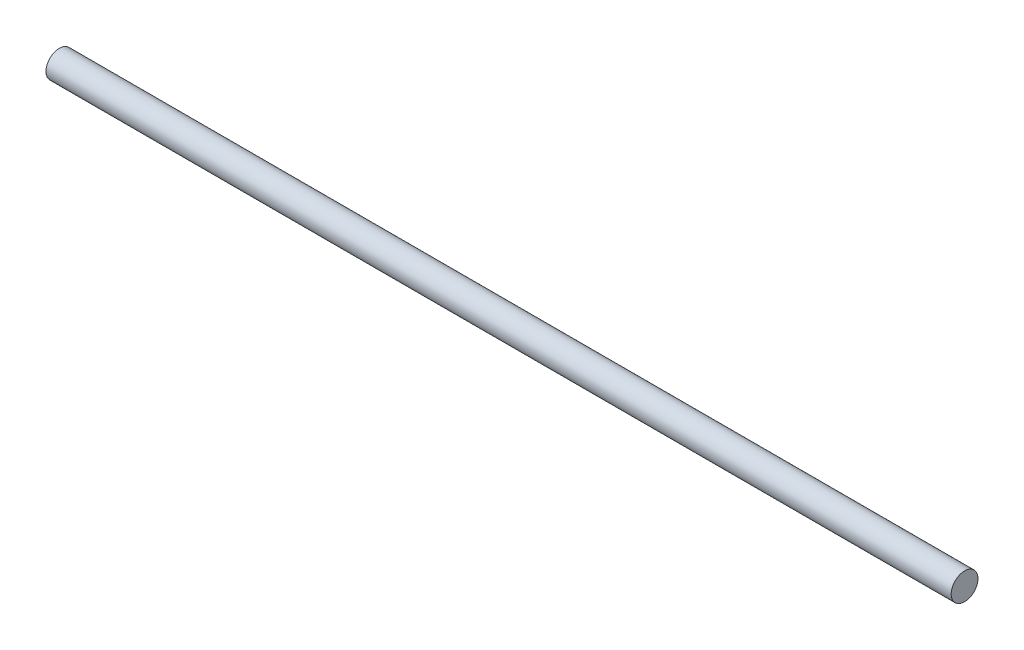
ISO-10303-21;
HEADER;
FILE_DESCRIPTION(('STEP AP214'),'2;1');
FILE_NAME('part.step','',(''),(''),'','','');
FILE_SCHEMA(('AUTOMOTIVE_DESIGN { 1 0 10303 214 1 1 1 1 }'));
ENDSEC;
DATA;
#1=APPLICATION_CONTEXT('core data for automotive mechanical design processes');
#2=APPLICATION_PROTOCOL_DEFINITION('international standard','automotive_design',2000,#1);
#3=PRODUCT_CONTEXT('',#1,'mechanical');
#4=PRODUCT('Part','Part','',(#3));
#5=PRODUCT_RELATED_PRODUCT_CATEGORY('part','',(#4));
#6=PRODUCT_DEFINITION_FORMATION('','',#4);
#7=PRODUCT_DEFINITION_CONTEXT('part definition',#1,'design');
#8=PRODUCT_DEFINITION('design','',#6,#7);
#9=PRODUCT_DEFINITION_SHAPE('','',#8);
#10=(LENGTH_UNIT() NAMED_UNIT(*) SI_UNIT(.MILLI.,.METRE.));
#11=(NAMED_UNIT(*) PLANE_ANGLE_UNIT() SI_UNIT($,.RADIAN.));
#12=(NAMED_UNIT(*) SI_UNIT($,.STERADIAN.) SOLID_ANGLE_UNIT());
#13=UNCERTAINTY_MEASURE_WITH_UNIT(LENGTH_MEASURE(1.E-05),#10,'distance_accuracy_value','');
#14=(GEOMETRIC_REPRESENTATION_CONTEXT(3) GLOBAL_UNCERTAINTY_ASSIGNED_CONTEXT((#13)) GLOBAL_UNIT_ASSIGNED_CONTEXT((#10,
#11,#12)) REPRESENTATION_CONTEXT('',''));
#15=CARTESIAN_POINT('',(0.,0.,0.));
#16=DIRECTION('',(0.,0.,1.));
#17=DIRECTION('',(1.,0.,0.));
#18=AXIS2_PLACEMENT_3D('',#15,#16,#17);
#19=CARTESIAN_POINT('',(270.,0.,0.));
#20=DIRECTION('',(-1.,0.,0.));
#21=DIRECTION('',(0.,0.,1.));
#22=AXIS2_PLACEMENT_3D('',#19,#20,#21);
#23=CYLINDRICAL_SURFACE('',#22,4.);
#24=CARTESIAN_POINT('',(270.,0.,0.));
#25=DIRECTION('',(1.,0.,0.));
#26=DIRECTION('',(0.,0.,-1.));
#27=AXIS2_PLACEMENT_3D('',#24,#25,#26);
#28=CIRCLE('',#27,4.);
#29=CARTESIAN_POINT('',(270.,0.,-4.));
#30=VERTEX_POINT('',#29);
#31=EDGE_CURVE('E10',#30,#30,#28,.T.);
#32=ORIENTED_EDGE('',*,*,#31,.F.);
#33=EDGE_LOOP('',(#32));
#34=FACE_BOUND('',#33,.T.);
#35=CARTESIAN_POINT('',(0.,0.,0.));
#36=DIRECTION('',(1.,0.,0.));
#37=DIRECTION('',(0.,0.,-1.));
#38=AXIS2_PLACEMENT_3D('',#35,#36,#37);
#39=CIRCLE('',#38,4.);
#40=CARTESIAN_POINT('',(0.,0.,-4.));
#41=VERTEX_POINT('',#40);
#42=EDGE_CURVE('E42',#41,#41,#39,.T.);
#43=ORIENTED_EDGE('',*,*,#42,.T.);
#44=EDGE_LOOP('',(#43));
#45=FACE_BOUND('',#44,.T.);
#46=ADVANCED_FACE('F39',(#34,#45),#23,.T.);
#47=CARTESIAN_POINT('',(270.,0.,0.));
#48=DIRECTION('',(1.,0.,0.));
#49=DIRECTION('',(0.,0.,-1.));
#50=AXIS2_PLACEMENT_3D('',#47,#48,#49);
#51=PLANE('',#50);
#52=ORIENTED_EDGE('',*,*,#31,.T.);
#53=EDGE_LOOP('',(#52));
#54=FACE_BOUND('',#53,.T.);
#55=ADVANCED_FACE('F68',(#54),#51,.T.);
#56=CARTESIAN_POINT('',(0.,0.,0.));
#57=DIRECTION('',(1.,0.,0.));
#58=DIRECTION('',(0.,0.,-1.));
#59=AXIS2_PLACEMENT_3D('',#56,#57,#58);
#60=PLANE('',#59);
#61=CARTESIAN_POINT('',(0.,0.,0.));
#62=DIRECTION('',(-1.,0.,0.));
#63=DIRECTION('',(0.,0.,1.));
#64=AXIS2_PLACEMENT_3D('',#61,#62,#63);
#65=CIRCLE('',#64,2.626);
#66=CARTESIAN_POINT('',(0.,0.,2.626));
#67=VERTEX_POINT('',#66);
#68=EDGE_CURVE('E51',#67,#67,#65,.T.);
#69=ORIENTED_EDGE('',*,*,#68,.F.);
#70=EDGE_LOOP('',(#69));
#71=FACE_BOUND('',#70,.T.);
#72=ORIENTED_EDGE('',*,*,#42,.F.);
#73=EDGE_LOOP('',(#72));
#74=FACE_BOUND('',#73,.T.);
#75=ADVANCED_FACE('F62',(#71,#74),#60,.F.);
#76=CARTESIAN_POINT('',(40.,0.,0.));
#77=DIRECTION('',(-1.,0.,0.));
#78=DIRECTION('',(0.,0.,1.));
#79=AXIS2_PLACEMENT_3D('',#76,#77,#78);
#80=CYLINDRICAL_SURFACE('',#79,2.626);
#81=CARTESIAN_POINT('',(40.,0.,0.));
#82=DIRECTION('',(-1.,0.,0.));
#83=DIRECTION('',(0.,0.,1.));
#84=AXIS2_PLACEMENT_3D('',#81,#82,#83);
#85=CIRCLE('',#84,2.626);
#86=CARTESIAN_POINT('',(40.,0.,2.626));
#87=VERTEX_POINT('',#86);
#88=EDGE_CURVE('E49',#87,#87,#85,.T.);
#89=ORIENTED_EDGE('',*,*,#88,.F.);
#90=EDGE_LOOP('',(#89));
#91=FACE_BOUND('',#90,.T.);
#92=ORIENTED_EDGE('',*,*,#68,.T.);
#93=EDGE_LOOP('',(#92));
#94=FACE_BOUND('',#93,.T.);
#95=ADVANCED_FACE('F59',(#91,#94),#80,.F.);
#96=CARTESIAN_POINT('',(40.,0.,0.));
#97=DIRECTION('',(-1.,0.,0.));
#98=DIRECTION('',(0.,0.,1.));
#99=AXIS2_PLACEMENT_3D('',#96,#97,#98);
#100=PLANE('',#99);
#101=ORIENTED_EDGE('',*,*,#88,.T.);
#102=EDGE_LOOP('',(#101));
#103=FACE_BOUND('',#102,.T.);
#104=ADVANCED_FACE('F57',(#103),#100,.T.);
#105=CLOSED_SHELL('',(#46,#55,#75,#95,#104));
#106=MANIFOLD_SOLID_BREP('B2',#105);
#107=ADVANCED_BREP_SHAPE_REPRESENTATION('',(#18,#106),#14);
#108=SHAPE_DEFINITION_REPRESENTATION(#9,#107);
ENDSEC;
END-ISO-10303-21;
